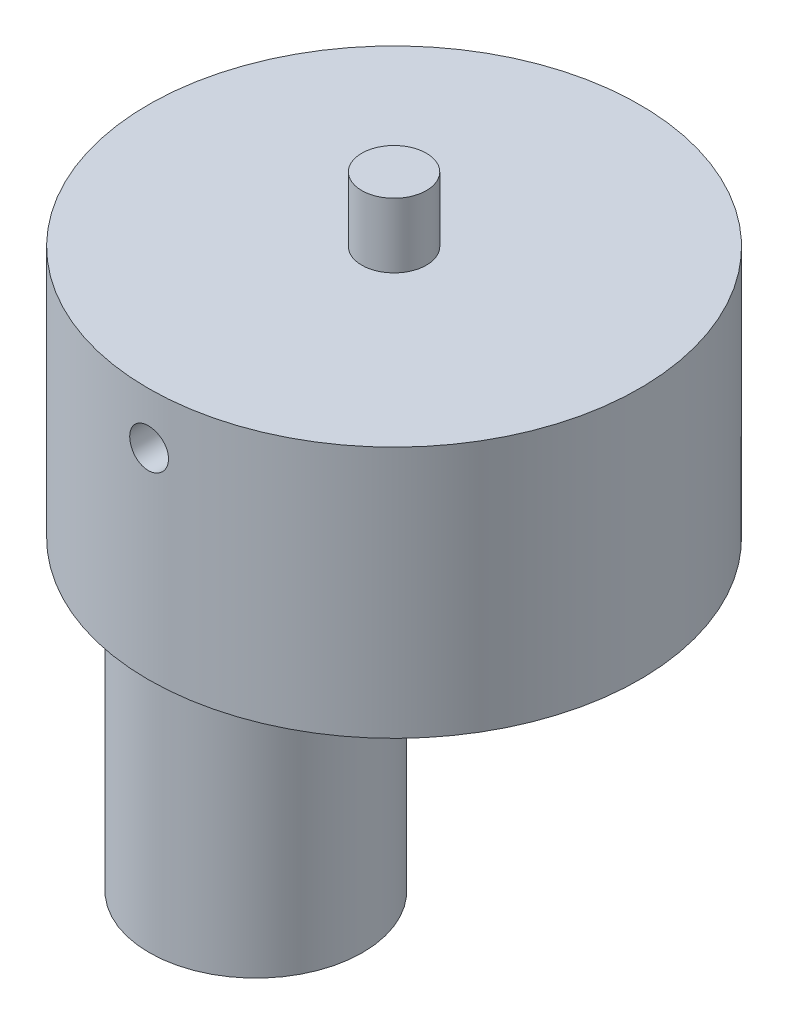
ISO-10303-21;
HEADER;
FILE_DESCRIPTION(('STEP AP214'),'2;1');
FILE_NAME('part.step','',(''),(''),'','','');
FILE_SCHEMA(('AUTOMOTIVE_DESIGN { 1 0 10303 214 1 1 1 1 }'));
ENDSEC;
DATA;
#1=APPLICATION_CONTEXT('core data for automotive mechanical design processes');
#2=APPLICATION_PROTOCOL_DEFINITION('international standard','automotive_design',2000,#1);
#3=PRODUCT_CONTEXT('',#1,'mechanical');
#4=PRODUCT('Part','Part','',(#3));
#5=PRODUCT_RELATED_PRODUCT_CATEGORY('part','',(#4));
#6=PRODUCT_DEFINITION_FORMATION('','',#4);
#7=PRODUCT_DEFINITION_CONTEXT('part definition',#1,'design');
#8=PRODUCT_DEFINITION('design','',#6,#7);
#9=PRODUCT_DEFINITION_SHAPE('','',#8);
#10=(LENGTH_UNIT() NAMED_UNIT(*) SI_UNIT(.MILLI.,.METRE.));
#11=(NAMED_UNIT(*) PLANE_ANGLE_UNIT() SI_UNIT($,.RADIAN.));
#12=(NAMED_UNIT(*) SI_UNIT($,.STERADIAN.) SOLID_ANGLE_UNIT());
#13=UNCERTAINTY_MEASURE_WITH_UNIT(LENGTH_MEASURE(1.E-05),#10,'distance_accuracy_value','');
#14=(GEOMETRIC_REPRESENTATION_CONTEXT(3) GLOBAL_UNCERTAINTY_ASSIGNED_CONTEXT((#13)) GLOBAL_UNIT_ASSIGNED_CONTEXT((#10,
#11,#12)) REPRESENTATION_CONTEXT('',''));
#15=CARTESIAN_POINT('',(0.,0.,0.));
#16=DIRECTION('',(0.,0.,1.));
#17=DIRECTION('',(1.,0.,0.));
#18=AXIS2_PLACEMENT_3D('',#15,#16,#17);
#19=CARTESIAN_POINT('',(0.,0.,0.));
#20=DIRECTION('',(0.,1.,0.));
#21=DIRECTION('',(0.,0.,1.));
#22=AXIS2_PLACEMENT_3D('',#19,#20,#21);
#23=PLANE('',#22);
#24=CARTESIAN_POINT('',(0.,0.,0.));
#25=DIRECTION('',(0.,1.,0.));
#26=DIRECTION('',(0.,0.,1.));
#27=AXIS2_PLACEMENT_3D('',#24,#25,#26);
#28=CIRCLE('',#27,38.);
#29=CARTESIAN_POINT('',(0.,0.,38.));
#30=VERTEX_POINT('',#29);
#31=EDGE_CURVE('E49',#30,#30,#28,.T.);
#32=ORIENTED_EDGE('',*,*,#31,.F.);
#33=EDGE_LOOP('',(#32));
#34=FACE_BOUND('',#33,.T.);
#35=CARTESIAN_POINT('',(-21.3727405232621,0.,0.));
#36=DIRECTION('',(0.,1.,0.));
#37=DIRECTION('',(0.,0.,1.));
#38=AXIS2_PLACEMENT_3D('',#35,#36,#37);
#39=CIRCLE('',#38,16.5);
#40=CARTESIAN_POINT('',(-21.3727405232621,0.,16.5));
#41=VERTEX_POINT('',#40);
#42=EDGE_CURVE('E10',#41,#41,#39,.F.);
#43=ORIENTED_EDGE('',*,*,#42,.F.);
#44=EDGE_LOOP('',(#43));
#45=FACE_BOUND('',#44,.T.);
#46=ADVANCED_FACE('F32',(#34,#45),#23,.F.);
#47=CARTESIAN_POINT('',(0.,39.,0.));
#48=DIRECTION('',(0.,1.,0.));
#49=DIRECTION('',(0.,0.,1.));
#50=AXIS2_PLACEMENT_3D('',#47,#48,#49);
#51=PLANE('',#50);
#52=CARTESIAN_POINT('',(0.,39.,0.));
#53=DIRECTION('',(0.,1.,0.));
#54=DIRECTION('',(0.,0.,1.));
#55=AXIS2_PLACEMENT_3D('',#52,#53,#54);
#56=CIRCLE('',#55,38.);
#57=CARTESIAN_POINT('',(0.,39.,38.));
#58=VERTEX_POINT('',#57);
#59=EDGE_CURVE('E44',#58,#58,#56,.T.);
#60=ORIENTED_EDGE('',*,*,#59,.T.);
#61=EDGE_LOOP('',(#60));
#62=FACE_BOUND('',#61,.T.);
#63=CARTESIAN_POINT('',(0.,39.,0.));
#64=DIRECTION('',(0.,1.,0.));
#65=DIRECTION('',(0.,0.,1.));
#66=AXIS2_PLACEMENT_3D('',#63,#64,#65);
#67=CIRCLE('',#66,5.);
#68=CARTESIAN_POINT('',(0.,39.,5.));
#69=VERTEX_POINT('',#68);
#70=EDGE_CURVE('E91',#69,#69,#67,.T.);
#71=ORIENTED_EDGE('',*,*,#70,.F.);
#72=EDGE_LOOP('',(#71));
#73=FACE_BOUND('',#72,.T.);
#74=ADVANCED_FACE('F78',(#62,#73),#51,.T.);
#75=CARTESIAN_POINT('',(0.,39.,0.));
#76=DIRECTION('',(0.,-1.,0.));
#77=DIRECTION('',(0.,0.,-1.));
#78=AXIS2_PLACEMENT_3D('',#75,#76,#77);
#79=CYLINDRICAL_SURFACE('',#78,38.);
#80=CARTESIAN_POINT('',(0.,34.,-38.));
#81=CARTESIAN_POINT('',(-0.168230277437706,33.9999926386835,-37.9999984430739));
#82=CARTESIAN_POINT('',(-0.336575845655094,33.9858016991693,-37.9988709200709));
#83=CARTESIAN_POINT('',(-0.668611397196741,33.9293989493033,-37.9944814128081));
#84=CARTESIAN_POINT('',(-0.832295850092009,33.8871551898294,-37.9912169949171));
#85=CARTESIAN_POINT('',(-1.15015205512757,33.7758740635707,-37.9829226863334));
#86=CARTESIAN_POINT('',(-1.30432904935511,33.7068516175222,-37.9778937789402));
#87=CARTESIAN_POINT('',(-1.59887136159142,33.5439985396355,-37.9666348413683));
#88=CARTESIAN_POINT('',(-1.73923967362019,33.4501733019165,-37.9604050724332));
#89=CARTESIAN_POINT('',(-2.00254103126273,33.2401440932732,-37.9474277075509));
#90=CARTESIAN_POINT('',(-2.12543792166293,33.1238948563935,-37.9406790810774));
#91=CARTESIAN_POINT('',(-2.34999780988339,32.8724128160596,-37.9274332919605));
#92=CARTESIAN_POINT('',(-2.45165988585508,32.7371791888784,-37.9209361402441));
#93=CARTESIAN_POINT('',(-2.63098484586303,32.4513506568285,-37.9089176287414));
#94=CARTESIAN_POINT('',(-2.708616254697,32.3007359462371,-37.903397552738));
#95=CARTESIAN_POINT('',(-2.83747510230931,31.9885588490599,-37.8939696224707));
#96=CARTESIAN_POINT('',(-2.8887029645124,31.8269966380823,-37.8900617423529));
#97=CARTESIAN_POINT('',(-2.96319644645853,31.4978706798196,-37.8843090780475));
#98=CARTESIAN_POINT('',(-2.98652059882487,31.3303202573578,-37.8824599758018));
#99=CARTESIAN_POINT('',(-3.00472536931326,30.99367318285,-37.8810204867557));
#100=CARTESIAN_POINT('',(-2.99960647157769,30.8245765571717,-37.8814300615093));
#101=CARTESIAN_POINT('',(-2.96111886260012,30.4900376899647,-37.8844577346025));
#102=CARTESIAN_POINT('',(-2.92781369865024,30.3245880862893,-37.8870708648728));
#103=CARTESIAN_POINT('',(-2.83399765916123,30.0016347848767,-37.8942034046858));
#104=CARTESIAN_POINT('',(-2.7734865418375,29.8441311577709,-37.8987228311701));
#105=CARTESIAN_POINT('',(-2.62690490032728,29.5413378502809,-37.9091644380148));
#106=CARTESIAN_POINT('',(-2.5408057912968,29.3960620640012,-37.9150881856644));
#107=CARTESIAN_POINT('',(-2.34551283184453,29.1220002120896,-37.9276694800349));
#108=CARTESIAN_POINT('',(-2.23631856235737,28.9932144457397,-37.9343270400699));
#109=CARTESIAN_POINT('',(-1.99757813910437,28.7554188410394,-37.947647885739));
#110=CARTESIAN_POINT('',(-1.86797703439474,28.6464641624137,-37.9543111370687));
#111=CARTESIAN_POINT('',(-1.59229376436977,28.4518498012088,-37.9668751419437));
#112=CARTESIAN_POINT('',(-1.44621158946689,28.3661901321813,-37.9727758950454));
#113=CARTESIAN_POINT('',(-1.14167761997914,28.2206010745297,-37.983150993084));
#114=CARTESIAN_POINT('',(-0.983224692335494,28.1606740460782,-37.9876252071703));
#115=CARTESIAN_POINT('',(-0.658463212690182,28.068289580571,-37.9946415451888));
#116=CARTESIAN_POINT('',(-0.492154807064351,28.0358316318804,-37.997183705107));
#117=CARTESIAN_POINT('',(-0.156881478742689,27.9993756555932,-38.0000448768352));
#118=CARTESIAN_POINT('',(0.0120751089608342,27.9953014208952,-38.0003698415183));
#119=CARTESIAN_POINT('',(0.348269003373996,28.015529010566,-37.9987758913175));
#120=CARTESIAN_POINT('',(0.51550632444248,28.0398305977531,-37.9968569951891));
#121=CARTESIAN_POINT('',(0.843297753735751,28.1160568502041,-37.9909950041868));
#122=CARTESIAN_POINT('',(1.00386010671882,28.1679462763297,-37.987054491835));
#123=CARTESIAN_POINT('',(1.31399900365978,28.2978393128922,-37.9775920824189));
#124=CARTESIAN_POINT('',(1.46357539119334,28.3758432950749,-37.972070162843));
#125=CARTESIAN_POINT('',(1.74784375041781,28.5559432895987,-37.9600494395666));
#126=CARTESIAN_POINT('',(1.88250358772923,28.6580898843025,-37.953548595394));
#127=CARTESIAN_POINT('',(2.13279217984117,28.8835023394889,-37.9403075453845));
#128=CARTESIAN_POINT('',(2.24842063776819,29.0067685293581,-37.9335673358158));
#129=CARTESIAN_POINT('',(2.45762484975141,29.2712513516483,-37.9205896766453));
#130=CARTESIAN_POINT('',(2.55115094155127,29.4125073309532,-37.9143533795852));
#131=CARTESIAN_POINT('',(2.71315523827201,29.7087637055825,-37.9031055627809));
#132=CARTESIAN_POINT('',(2.78163367119924,29.8637639757781,-37.8980940318878));
#133=CARTESIAN_POINT('',(2.89151387110069,30.1829319002128,-37.8898693720601));
#134=CARTESIAN_POINT('',(2.93294623887225,30.347088965001,-37.8866542112497));
#135=CARTESIAN_POINT('',(2.98765790023767,30.6800561496268,-37.8823793491511));
#136=CARTESIAN_POINT('',(3.00093767292138,30.8488661902323,-37.8813196111828));
#137=CARTESIAN_POINT('',(2.99896188688676,31.1858538589429,-37.8814760426207));
#138=CARTESIAN_POINT('',(2.98378436644712,31.3540319530016,-37.8826859878913));
#139=CARTESIAN_POINT('',(2.92548733876923,31.6854428730191,-37.887232237977));
#140=CARTESIAN_POINT('',(2.88236778675551,31.848675691053,-37.8905685461995));
#141=CARTESIAN_POINT('',(2.76943001015431,32.1655689968701,-37.8989899804525));
#142=CARTESIAN_POINT('',(2.69961296444522,32.3192299069707,-37.9040750292632));
#143=CARTESIAN_POINT('',(2.53527109638201,32.6126617809489,-37.9154210711218));
#144=CARTESIAN_POINT('',(2.44074672054795,32.7524329957832,-37.9216820429175));
#145=CARTESIAN_POINT('',(2.2293806238227,33.014516802884,-37.9346948182221));
#146=CARTESIAN_POINT('',(2.11248130954252,33.1367828851543,-37.941447859921));
#147=CARTESIAN_POINT('',(1.85978424897897,33.3600055613042,-37.954672635902));
#148=CARTESIAN_POINT('',(1.72398192526552,33.4609569788156,-37.9611443015481));
#149=CARTESIAN_POINT('',(1.43709756450134,33.6388054256755,-37.9730876131211));
#150=CARTESIAN_POINT('',(1.28598975831931,33.7156609643729,-37.978557527474));
#151=CARTESIAN_POINT('',(0.973076064569838,33.8428120018995,-37.9878601967286));
#152=CARTESIAN_POINT('',(0.811282773093939,33.8931381663325,-37.9916948408735));
#153=CARTESIAN_POINT('',(0.540438770546252,33.9529229657203,-37.9963056825779));
#154=CARTESIAN_POINT('',(0.433132098217294,33.9705535391703,-37.9976847801056));
#155=CARTESIAN_POINT('',(0.217232975456253,33.9940944195064,-37.9995324404705));
#156=CARTESIAN_POINT('',(0.108640528034264,34.0000047538251,-38.0000010054389));
#157=CARTESIAN_POINT('',(0.,34.,-38.));
#158=B_SPLINE_CURVE_WITH_KNOTS('',3,(#80,#81,#82,#83,#84,#85,#86,#87,#88,#89,#90,#91,#92,#93,
#94,#95,#96,#97,#98,#99,#100,#101,#102,#103,#104,#105,#106,#107,#108,#109,#110,#111,#112,#113,
#114,#115,#116,#117,#118,#119,#120,#121,#122,#123,#124,#125,#126,#127,#128,#129,#130,#131,#132,
#133,#134,#135,#136,#137,#138,#139,#140,#141,#142,#143,#144,#145,#146,#147,#148,#149,#150,#151,
#152,#153,#154,#155,#156,#157),.UNSPECIFIED.,.T.,.F.,(4,2,2,2,2,2,2,2,2,2,2,2,2,2,2,2,2,2,2,2,2,
2,2,2,2,2,2,2,2,2,2,2,2,2,2,2,2,2,4),(0.,0.50429418854674,1.00916370078726,1.51375230936014,
2.01823126998903,2.5237394549149,3.0292695804704,3.53545907123703,4.04164044416132,
4.54675814609821,5.05186725021796,5.55584058602809,6.05981840083594,6.56436134901273,
7.06891345298729,7.57484819748389,8.0807832362998,8.5867646690735,9.09273667730812,
9.59734968185782,10.1019584685879,10.6059242398503,11.1098971854695,11.614935538604,
12.1199817691652,12.6261522324058,13.1323180879118,13.6379102536977,14.1434938154447,
14.6476929456065,15.1518928837201,15.6560705605014,16.1602391262259,16.6657233184336,
17.1713301290485,17.6778028214878,18.183688785524,18.5093549854357,18.8350204230892),.UNSPECIFIED.);
#159=CARTESIAN_POINT('',(0.,34.,-38.));
#160=VERTEX_POINT('',#159);
#161=EDGE_CURVE('E37',#160,#160,#158,.T.);
#162=ORIENTED_EDGE('',*,*,#161,.T.);
#163=EDGE_LOOP('',(#162));
#164=FACE_BOUND('',#163,.T.);
#165=CARTESIAN_POINT('',(3.,31.,37.8813938497516));
#166=CARTESIAN_POINT('',(2.99999263785232,30.8317706437763,37.881395424836));
#167=CARTESIAN_POINT('',(2.98580184849922,30.6634259937545,37.8825265582867));
#168=CARTESIAN_POINT('',(2.92939974932902,30.3313923500421,37.8869289647691));
#169=CARTESIAN_POINT('',(2.88715648723707,30.1677088875004,37.8902026781767));
#170=CARTESIAN_POINT('',(2.77587681608236,29.8498547762425,37.8985171541647));
#171=CARTESIAN_POINT('',(2.70685535144458,29.6956788770518,37.9035569309858));
#172=CARTESIAN_POINT('',(2.54400458445208,29.4011383983101,37.9148344391245));
#173=CARTESIAN_POINT('',(2.45018067379416,29.2607708261153,37.92107191));
#174=CARTESIAN_POINT('',(2.24015280345188,28.9974686277324,37.9340582512773));
#175=CARTESIAN_POINT('',(2.12390328154721,28.8745703923635,37.9408081455451));
#176=CARTESIAN_POINT('',(1.87242010716812,28.6500079098616,37.9540493837728));
#177=CARTESIAN_POINT('',(1.73718563462831,28.5483445804542,37.9605407165486));
#178=CARTESIAN_POINT('',(1.45135636719248,28.369018313893,37.9725429812434));
#179=CARTESIAN_POINT('',(1.30074191190181,28.291386620576,37.9780526329515));
#180=CARTESIAN_POINT('',(0.988565369760015,28.162527176509,37.9874597537665));
#181=CARTESIAN_POINT('',(0.827003457103224,28.1112990057416,37.9913572485189));
#182=CARTESIAN_POINT('',(0.497878390626908,28.0368048728462,37.9970937704964));
#183=CARTESIAN_POINT('',(0.33032856701674,28.0134803532146,37.998937107936));
#184=CARTESIAN_POINT('',(-0.00631733654750589,27.9952746407321,38.0003722094706));
#185=CARTESIAN_POINT('',(-0.175413390347668,28.000392967666,37.9999640115795));
#186=CARTESIAN_POINT('',(-0.509954787192963,28.0388796775189,37.9969456003133));
#187=CARTESIAN_POINT('',(-0.675407425277909,28.0721850875983,37.9943402955467));
#188=CARTESIAN_POINT('',(-0.998366668593192,28.1660026729498,37.9872264182713));
#189=CARTESIAN_POINT('',(-1.1558732048081,28.2265150844816,37.9827178292348));
#190=CARTESIAN_POINT('',(-1.45867002090717,28.3730993962644,37.9722962502068));
#191=CARTESIAN_POINT('',(-1.6039465541759,28.4591995778296,37.9663817077167));
#192=CARTESIAN_POINT('',(-1.87800944429183,28.654494821333,37.9538131184224));
#193=CARTESIAN_POINT('',(-2.00679550141833,28.7636903029414,37.9471590581814));
#194=CARTESIAN_POINT('',(-2.24458971981857,29.002431580277,37.9338380622355));
#195=CARTESIAN_POINT('',(-2.35354296660022,29.1320320809288,37.9271711409281));
#196=CARTESIAN_POINT('',(-2.54815472752468,29.4077136342806,37.9145941321889));
#197=CARTESIAN_POINT('',(-2.63381322519709,29.553794698633,37.9086840452923));
#198=CARTESIAN_POINT('',(-2.77940144234372,29.8583283793926,37.8982886351211));
#199=CARTESIAN_POINT('',(-2.83932843779762,30.0167823035334,37.8938034627057));
#200=CARTESIAN_POINT('',(-2.93171253141032,30.3415459473737,37.8867684945926));
#201=CARTESIAN_POINT('',(-2.96417014717686,30.5078555189861,37.8842186624274));
#202=CARTESIAN_POINT('',(-3.00062486955395,30.843129370412,37.8813488492974));
#203=CARTESIAN_POINT('',(-3.00469849779479,31.0120852808075,37.8810228729924));
#204=CARTESIAN_POINT('',(-2.98446993701009,31.3482776744795,37.8826218486592));
#205=CARTESIAN_POINT('',(-2.96016798514649,31.5155141721149,37.884546781818));
#206=CARTESIAN_POINT('',(-2.88394184726828,31.8433016032549,37.8904252096708));
#207=CARTESIAN_POINT('',(-2.83205326228916,32.0038608665532,37.8943760896121));
#208=CARTESIAN_POINT('',(-2.70216294400362,32.3139939567773,37.9038590548662));
#209=CARTESIAN_POINT('',(-2.62416083401247,32.4635676251993,37.9093911629878));
#210=CARTESIAN_POINT('',(-2.44406357833825,32.7478341613756,37.9214277776749));
#211=CARTESIAN_POINT('',(-2.34191737427747,32.8824945929649,37.9279343341079));
#212=CARTESIAN_POINT('',(-2.11650535947004,33.13278456635,37.9411797159946));
#213=CARTESIAN_POINT('',(-1.99323922217929,33.2484138138424,37.9479185450382));
#214=CARTESIAN_POINT('',(-1.72875604909499,33.4576196898016,37.9608869464052));
#215=CARTESIAN_POINT('',(-1.58749965829182,33.5511466469759,37.9671153515116));
#216=CARTESIAN_POINT('',(-1.29124223392212,33.7131524628797,37.9783443227055));
#217=CARTESIAN_POINT('',(-1.13624132557013,33.7816315497699,37.983344899977));
#218=CARTESIAN_POINT('',(-0.817073838218855,33.8915121915042,37.9915493740706));
#219=CARTESIAN_POINT('',(-0.652917946506944,33.9329446303273,37.9947553195452));
#220=CARTESIAN_POINT('',(-0.319953232508932,33.9876568314396,37.999017594232));
#221=CARTESIAN_POINT('',(-0.151144488421418,34.0009370665795,38.0000739595491));
#222=CARTESIAN_POINT('',(0.185844007724722,33.9989626117476,37.9999181203354));
#223=CARTESIAN_POINT('',(0.354024222061248,33.9837854056211,37.9987120758837));
#224=CARTESIAN_POINT('',(0.685439460070171,33.9254882598585,37.9941791393791));
#225=CARTESIAN_POINT('',(0.848674476485684,33.8823682792196,37.9908522442141));
#226=CARTESIAN_POINT('',(1.16557212517757,33.7694288356519,37.9824510315142));
#227=CARTESIAN_POINT('',(1.3192351758783,33.6996105407543,37.9773767904253));
#228=CARTESIAN_POINT('',(1.61267080850137,33.5352655130557,37.9660490429656));
#229=CARTESIAN_POINT('',(1.7524436427022,33.4407392291222,37.9597955580186));
#230=CARTESIAN_POINT('',(2.01452730784427,33.2293710536412,37.9467913112364));
#231=CARTESIAN_POINT('',(2.13679197870458,33.1124720037035,37.9400393035084));
#232=CARTESIAN_POINT('',(2.3600119308789,32.8597760497767,37.926809547746));
#233=CARTESIAN_POINT('',(2.46096203215627,32.7239745652419,37.9203318666858));
#234=CARTESIAN_POINT('',(2.63880908526894,32.4370908681167,37.9083720300883));
#235=CARTESIAN_POINT('',(2.71566430398237,32.2859827361503,37.9028916086487));
#236=CARTESIAN_POINT('',(2.8428146526227,31.9730683473682,37.8935681492736));
#237=CARTESIAN_POINT('',(2.89314045280837,31.8112746886204,37.8897232215665));
#238=CARTESIAN_POINT('',(2.95292421077471,31.540431663187,37.8850993601198));
#239=CARTESIAN_POINT('',(2.97055431578336,31.4331264089155,37.883716139462));
#240=CARTESIAN_POINT('',(2.99409457369405,31.2172301281134,37.8818628767795));
#241=CARTESIAN_POINT('',(3.00000475432558,31.1086391046256,37.8813928325941));
#242=CARTESIAN_POINT('',(3.,31.,37.8813938497516));
#243=B_SPLINE_CURVE_WITH_KNOTS('',3,(#165,#166,#167,#168,#169,#170,#171,#172,#173,#174,#175,
#176,#177,#178,#179,#180,#181,#182,#183,#184,#185,#186,#187,#188,#189,#190,#191,#192,#193,#194,
#195,#196,#197,#198,#199,#200,#201,#202,#203,#204,#205,#206,#207,#208,#209,#210,#211,#212,#213,
#214,#215,#216,#217,#218,#219,#220,#221,#222,#223,#224,#225,#226,#227,#228,#229,#230,#231,#232,
#233,#234,#235,#236,#237,#238,#239,#240,#241,#242),.UNSPECIFIED.,.T.,.F.,(4,2,2,2,2,2,2,2,2,2,2,
2,2,2,2,2,2,2,2,2,2,2,2,2,2,2,2,2,2,2,2,2,2,2,2,2,2,2,4),(0.,0.504291421669991,1.00915822788302,
1.51374368152856,2.01821953559138,2.52373134073237,3.02926498845646,3.53545315301367,
4.04163326507022,4.54674925358301,5.05185671399059,5.55583868228783,6.05982502713928,
6.56437049631087,7.0689251344883,7.57485624621251,8.08078771565084,8.58677273143868,
9.09274821269731,9.59735908295556,10.1019657357268,10.6059227598395,11.10988705379,
11.6149267875576,12.1199743306603,12.6261463157289,13.1323136899712,13.6379020669613,
14.1434819519093,14.6476872439429,15.1518932758424,15.6560772516295,16.1602520685946,
16.6657325841807,17.1713358046313,17.6778099691558,18.1836973153048,18.5093592531184,
18.8350204204103),.UNSPECIFIED.);
#244=CARTESIAN_POINT('',(3.,31.,37.8813938497516));
#245=VERTEX_POINT('',#244);
#246=EDGE_CURVE('E52',#245,#245,#243,.T.);
#247=ORIENTED_EDGE('',*,*,#246,.T.);
#248=EDGE_LOOP('',(#247));
#249=FACE_BOUND('',#248,.T.);
#250=ORIENTED_EDGE('',*,*,#59,.F.);
#251=EDGE_LOOP('',(#250));
#252=FACE_BOUND('',#251,.T.);
#253=ORIENTED_EDGE('',*,*,#31,.T.);
#254=EDGE_LOOP('',(#253));
#255=FACE_BOUND('',#254,.T.);
#256=ADVANCED_FACE('F34',(#164,#249,#252,#255),#79,.T.);
#257=CARTESIAN_POINT('',(0.,49.,0.));
#258=DIRECTION('',(0.,-1.,0.));
#259=DIRECTION('',(0.,0.,-1.));
#260=AXIS2_PLACEMENT_3D('',#257,#258,#259);
#261=CYLINDRICAL_SURFACE('',#260,5.);
#262=CARTESIAN_POINT('',(0.,49.,0.));
#263=DIRECTION('',(0.,1.,0.));
#264=DIRECTION('',(0.,0.,1.));
#265=AXIS2_PLACEMENT_3D('',#262,#263,#264);
#266=CIRCLE('',#265,5.);
#267=CARTESIAN_POINT('',(0.,49.,5.));
#268=VERTEX_POINT('',#267);
#269=EDGE_CURVE('E89',#268,#268,#266,.T.);
#270=ORIENTED_EDGE('',*,*,#269,.F.);
#271=EDGE_LOOP('',(#270));
#272=FACE_BOUND('',#271,.T.);
#273=ORIENTED_EDGE('',*,*,#70,.T.);
#274=EDGE_LOOP('',(#273));
#275=FACE_BOUND('',#274,.T.);
#276=ADVANCED_FACE('F73',(#272,#275),#261,.T.);
#277=CARTESIAN_POINT('',(0.,49.,0.));
#278=DIRECTION('',(0.,1.,0.));
#279=DIRECTION('',(0.,0.,1.));
#280=AXIS2_PLACEMENT_3D('',#277,#278,#279);
#281=PLANE('',#280);
#282=ORIENTED_EDGE('',*,*,#269,.T.);
#283=EDGE_LOOP('',(#282));
#284=FACE_BOUND('',#283,.T.);
#285=ADVANCED_FACE('F69',(#284),#281,.T.);
#286=CARTESIAN_POINT('',(-21.3727405232621,-58.,0.));
#287=DIRECTION('',(0.,1.,0.));
#288=DIRECTION('',(0.,0.,1.));
#289=AXIS2_PLACEMENT_3D('',#286,#287,#288);
#290=CYLINDRICAL_SURFACE('',#289,16.5);
#291=CARTESIAN_POINT('',(-21.3727405232621,-58.,0.));
#292=DIRECTION('',(0.,-1.,0.));
#293=DIRECTION('',(0.,0.,-1.));
#294=AXIS2_PLACEMENT_3D('',#291,#292,#293);
#295=CIRCLE('',#294,16.5);
#296=CARTESIAN_POINT('',(-21.3727405232621,-58.,16.5));
#297=VERTEX_POINT('',#296);
#298=EDGE_CURVE('E95',#297,#297,#295,.T.);
#299=CARTESIAN_POINT('',(-21.3727405232621,-58.,16.5));
#300=CARTESIAN_POINT('',(-21.3727405232621,-57.3958333333333,16.5));
#301=CARTESIAN_POINT('',(-21.3727405232621,-56.7916666666667,16.5));
#302=CARTESIAN_POINT('',(-21.3727405232621,-55.5833333333333,16.5));
#303=CARTESIAN_POINT('',(-21.3727405232621,-54.9791666666667,16.5));
#304=CARTESIAN_POINT('',(-21.3727405232621,-53.7708333333333,16.5));
#305=CARTESIAN_POINT('',(-21.3727405232621,-53.1666666666667,16.5));
#306=CARTESIAN_POINT('',(-21.3727405232621,-51.9583333333333,16.5));
#307=CARTESIAN_POINT('',(-21.3727405232621,-51.3541666666667,16.5));
#308=CARTESIAN_POINT('',(-21.3727405232621,-50.1458333333333,16.5));
#309=CARTESIAN_POINT('',(-21.3727405232621,-49.5416666666667,16.5));
#310=CARTESIAN_POINT('',(-21.3727405232621,-48.3333333333333,16.5));
#311=CARTESIAN_POINT('',(-21.3727405232621,-47.7291666666667,16.5));
#312=CARTESIAN_POINT('',(-21.3727405232621,-46.5208333333333,16.5));
#313=CARTESIAN_POINT('',(-21.3727405232621,-45.9166666666667,16.5));
#314=CARTESIAN_POINT('',(-21.3727405232621,-44.7083333333333,16.5));
#315=CARTESIAN_POINT('',(-21.3727405232621,-44.1041666666667,16.5));
#316=CARTESIAN_POINT('',(-21.3727405232621,-42.8958333333333,16.5));
#317=CARTESIAN_POINT('',(-21.3727405232621,-42.2916666666667,16.5));
#318=CARTESIAN_POINT('',(-21.3727405232621,-41.0833333333333,16.5));
#319=CARTESIAN_POINT('',(-21.3727405232621,-40.4791666666667,16.5));
#320=CARTESIAN_POINT('',(-21.3727405232621,-39.2708333333333,16.5));
#321=CARTESIAN_POINT('',(-21.3727405232621,-38.6666666666667,16.5));
#322=CARTESIAN_POINT('',(-21.3727405232621,-37.4583333333333,16.5));
#323=CARTESIAN_POINT('',(-21.3727405232621,-36.8541666666667,16.5));
#324=CARTESIAN_POINT('',(-21.3727405232621,-35.6458333333333,16.5));
#325=CARTESIAN_POINT('',(-21.3727405232621,-35.0416666666667,16.5));
#326=CARTESIAN_POINT('',(-21.3727405232621,-33.8333333333333,16.5));
#327=CARTESIAN_POINT('',(-21.3727405232621,-33.2291666666667,16.5));
#328=CARTESIAN_POINT('',(-21.3727405232621,-32.0208333333333,16.5));
#329=CARTESIAN_POINT('',(-21.3727405232621,-31.4166666666667,16.5));
#330=CARTESIAN_POINT('',(-21.3727405232621,-30.2083333333333,16.5));
#331=CARTESIAN_POINT('',(-21.3727405232621,-29.6041666666667,16.5));
#332=CARTESIAN_POINT('',(-21.3727405232621,-28.3958333333333,16.5));
#333=CARTESIAN_POINT('',(-21.3727405232621,-27.7916666666667,16.5));
#334=CARTESIAN_POINT('',(-21.3727405232621,-26.5833333333333,16.5));
#335=CARTESIAN_POINT('',(-21.3727405232621,-25.9791666666667,16.5));
#336=CARTESIAN_POINT('',(-21.3727405232621,-24.7708333333333,16.5));
#337=CARTESIAN_POINT('',(-21.3727405232621,-24.1666666666667,16.5));
#338=CARTESIAN_POINT('',(-21.3727405232621,-22.9583333333333,16.5));
#339=CARTESIAN_POINT('',(-21.3727405232621,-22.3541666666667,16.5));
#340=CARTESIAN_POINT('',(-21.3727405232621,-21.1458333333333,16.5));
#341=CARTESIAN_POINT('',(-21.3727405232621,-20.5416666666667,16.5));
#342=CARTESIAN_POINT('',(-21.3727405232621,-19.3333333333333,16.5));
#343=CARTESIAN_POINT('',(-21.3727405232621,-18.7291666666667,16.5));
#344=CARTESIAN_POINT('',(-21.3727405232621,-17.5208333333333,16.5));
#345=CARTESIAN_POINT('',(-21.3727405232621,-16.9166666666667,16.5));
#346=CARTESIAN_POINT('',(-21.3727405232621,-15.7083333333333,16.5));
#347=CARTESIAN_POINT('',(-21.3727405232621,-15.1041666666667,16.5));
#348=CARTESIAN_POINT('',(-21.3727405232621,-13.8958333333333,16.5));
#349=CARTESIAN_POINT('',(-21.3727405232621,-13.2916666666667,16.5));
#350=CARTESIAN_POINT('',(-21.3727405232621,-12.0833333333333,16.5));
#351=CARTESIAN_POINT('',(-21.3727405232621,-11.4791666666667,16.5));
#352=CARTESIAN_POINT('',(-21.3727405232621,-10.2708333333333,16.5));
#353=CARTESIAN_POINT('',(-21.3727405232621,-9.66666666666667,16.5));
#354=CARTESIAN_POINT('',(-21.3727405232621,-8.45833333333333,16.5));
#355=CARTESIAN_POINT('',(-21.3727405232621,-7.85416666666667,16.5));
#356=CARTESIAN_POINT('',(-21.3727405232621,-6.64583333333333,16.5));
#357=CARTESIAN_POINT('',(-21.3727405232621,-6.04166666666667,16.5));
#358=CARTESIAN_POINT('',(-21.3727405232621,-4.83333333333333,16.5));
#359=CARTESIAN_POINT('',(-21.3727405232621,-4.22916666666667,16.5));
#360=CARTESIAN_POINT('',(-21.3727405232621,-3.02083333333334,16.5));
#361=CARTESIAN_POINT('',(-21.3727405232621,-2.41666666666667,16.5));
#362=CARTESIAN_POINT('',(-21.3727405232621,-1.20833333333333,16.5));
#363=CARTESIAN_POINT('',(-21.3727405232621,-0.604166666666666,16.5));
#364=CARTESIAN_POINT('',(-21.3727405232621,0.,16.5));
#365=B_SPLINE_CURVE_WITH_KNOTS('',3,(#299,#300,#301,#302,#303,#304,#305,#306,#307,#308,#309,
#310,#311,#312,#313,#314,#315,#316,#317,#318,#319,#320,#321,#322,#323,#324,#325,#326,#327,#328,
#329,#330,#331,#332,#333,#334,#335,#336,#337,#338,#339,#340,#341,#342,#343,#344,#345,#346,#347,
#348,#349,#350,#351,#352,#353,#354,#355,#356,#357,#358,#359,#360,#361,#362,#363,#364),
.UNSPECIFIED.,.F.,.F.,(4,2,2,2,2,2,2,2,2,2,2,2,2,2,2,2,2,2,2,2,2,2,2,2,2,2,2,2,2,2,2,2,4),(0.,
1.8125,3.625,5.4375,7.25000000000001,9.0625,10.875,12.6875,14.5,16.3125,18.125,19.9375,21.75,
23.5625,25.375,27.1875,29.,30.8125,32.625,34.4375,36.25,38.0625,39.875,41.6875,43.5,45.3125,
47.125,48.9375,50.75,52.5625,54.375,56.1875,58.),.UNSPECIFIED.);
#366=EDGE_CURVE('BSEAM65',#297,#41,#365,.T.);
#367=ORIENTED_EDGE('',*,*,#298,.F.);
#368=ORIENTED_EDGE('',*,*,#42,.T.);
#369=ORIENTED_EDGE('',*,*,#366,.T.);
#370=ORIENTED_EDGE('',*,*,#366,.F.);
#371=EDGE_LOOP('',(#367,#369,#368,#370));
#372=FACE_BOUND('',#371,.T.);
#373=ADVANCED_FACE('F65',(#372),#290,.T.);
#374=CARTESIAN_POINT('',(-21.3727405232621,-58.,0.));
#375=DIRECTION('',(0.,-1.,0.));
#376=DIRECTION('',(0.,0.,-1.));
#377=AXIS2_PLACEMENT_3D('',#374,#375,#376);
#378=PLANE('',#377);
#379=ORIENTED_EDGE('',*,*,#298,.T.);
#380=EDGE_LOOP('',(#379));
#381=FACE_BOUND('',#380,.T.);
#382=ADVANCED_FACE('F60',(#381),#378,.T.);
#383=CARTESIAN_POINT('',(0.,31.,-50.));
#384=DIRECTION('',(0.,0.,1.));
#385=DIRECTION('',(1.,0.,0.));
#386=AXIS2_PLACEMENT_3D('',#383,#384,#385);
#387=CYLINDRICAL_SURFACE('',#386,3.);
#388=ORIENTED_EDGE('',*,*,#246,.F.);
#389=EDGE_LOOP('',(#388));
#390=FACE_BOUND('',#389,.T.);
#391=ORIENTED_EDGE('',*,*,#161,.F.);
#392=EDGE_LOOP('',(#391));
#393=FACE_BOUND('',#392,.T.);
#394=ADVANCED_FACE('F56',(#390,#393),#387,.F.);
#395=CLOSED_SHELL('',(#46,#74,#256,#276,#285,#373,#382,#394));
#396=MANIFOLD_SOLID_BREP('B2',#395);
#397=ADVANCED_BREP_SHAPE_REPRESENTATION('',(#18,#396),#14);
#398=SHAPE_DEFINITION_REPRESENTATION(#9,#397);
ENDSEC;
END-ISO-10303-21;
